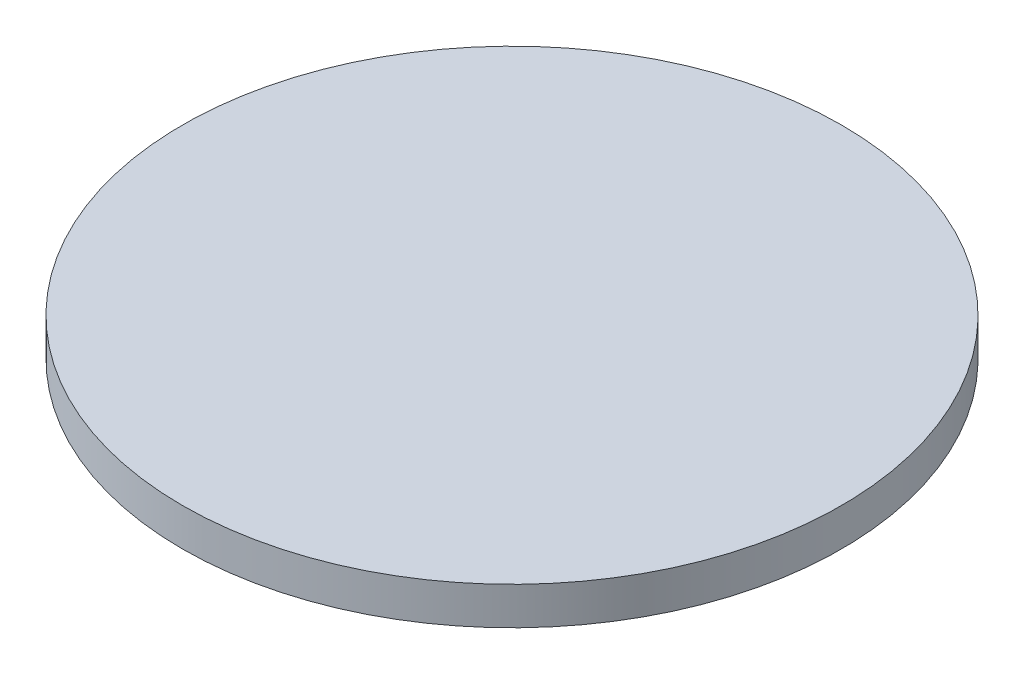
ISO-10303-21;
HEADER;
FILE_DESCRIPTION(('STEP AP214'),'2;1');
FILE_NAME('part.step','',(''),(''),'','','');
FILE_SCHEMA(('AUTOMOTIVE_DESIGN { 1 0 10303 214 1 1 1 1 }'));
ENDSEC;
DATA;
#1=APPLICATION_CONTEXT('core data for automotive mechanical design processes');
#2=APPLICATION_PROTOCOL_DEFINITION('international standard','automotive_design',2000,#1);
#3=PRODUCT_CONTEXT('',#1,'mechanical');
#4=PRODUCT('Part','Part','',(#3));
#5=PRODUCT_RELATED_PRODUCT_CATEGORY('part','',(#4));
#6=PRODUCT_DEFINITION_FORMATION('','',#4);
#7=PRODUCT_DEFINITION_CONTEXT('part definition',#1,'design');
#8=PRODUCT_DEFINITION('design','',#6,#7);
#9=PRODUCT_DEFINITION_SHAPE('','',#8);
#10=(LENGTH_UNIT() NAMED_UNIT(*) SI_UNIT(.MILLI.,.METRE.));
#11=(NAMED_UNIT(*) PLANE_ANGLE_UNIT() SI_UNIT($,.RADIAN.));
#12=(NAMED_UNIT(*) SI_UNIT($,.STERADIAN.) SOLID_ANGLE_UNIT());
#13=UNCERTAINTY_MEASURE_WITH_UNIT(LENGTH_MEASURE(1.E-05),#10,'distance_accuracy_value','');
#14=(GEOMETRIC_REPRESENTATION_CONTEXT(3) GLOBAL_UNCERTAINTY_ASSIGNED_CONTEXT((#13)) GLOBAL_UNIT_ASSIGNED_CONTEXT((#10,
#11,#12)) REPRESENTATION_CONTEXT('',''));
#15=CARTESIAN_POINT('',(0.,0.,0.));
#16=DIRECTION('',(0.,0.,1.));
#17=DIRECTION('',(1.,0.,0.));
#18=AXIS2_PLACEMENT_3D('',#15,#16,#17);
#19=CARTESIAN_POINT('',(0.,10.,0.));
#20=DIRECTION('',(0.,-1.,0.));
#21=DIRECTION('',(0.,0.,-1.));
#22=AXIS2_PLACEMENT_3D('',#19,#20,#21);
#23=CYLINDRICAL_SURFACE('',#22,87.5);
#24=CARTESIAN_POINT('',(0.,10.,0.));
#25=DIRECTION('',(0.,1.,0.));
#26=DIRECTION('',(0.,0.,1.));
#27=AXIS2_PLACEMENT_3D('',#24,#25,#26);
#28=CIRCLE('',#27,87.5);
#29=CARTESIAN_POINT('',(0.,10.,87.5));
#30=VERTEX_POINT('',#29);
#31=EDGE_CURVE('E10',#30,#30,#28,.T.);
#32=ORIENTED_EDGE('',*,*,#31,.F.);
#33=EDGE_LOOP('',(#32));
#34=FACE_BOUND('',#33,.T.);
#35=CARTESIAN_POINT('',(0.,0.,0.));
#36=DIRECTION('',(0.,1.,0.));
#37=DIRECTION('',(0.,0.,1.));
#38=AXIS2_PLACEMENT_3D('',#35,#36,#37);
#39=CIRCLE('',#38,87.5);
#40=CARTESIAN_POINT('',(0.,0.,87.5));
#41=VERTEX_POINT('',#40);
#42=EDGE_CURVE('E40',#41,#41,#39,.T.);
#43=ORIENTED_EDGE('',*,*,#42,.T.);
#44=EDGE_LOOP('',(#43));
#45=FACE_BOUND('',#44,.T.);
#46=ADVANCED_FACE('F37',(#34,#45),#23,.T.);
#47=CARTESIAN_POINT('',(0.,10.,0.));
#48=DIRECTION('',(0.,1.,0.));
#49=DIRECTION('',(0.,0.,1.));
#50=AXIS2_PLACEMENT_3D('',#47,#48,#49);
#51=PLANE('',#50);
#52=ORIENTED_EDGE('',*,*,#31,.T.);
#53=EDGE_LOOP('',(#52));
#54=FACE_BOUND('',#53,.T.);
#55=ADVANCED_FACE('F54',(#54),#51,.T.);
#56=CARTESIAN_POINT('',(0.,0.,0.));
#57=DIRECTION('',(0.,1.,0.));
#58=DIRECTION('',(0.,0.,1.));
#59=AXIS2_PLACEMENT_3D('',#56,#57,#58);
#60=PLANE('',#59);
#61=ORIENTED_EDGE('',*,*,#42,.F.);
#62=EDGE_LOOP('',(#61));
#63=FACE_BOUND('',#62,.T.);
#64=ADVANCED_FACE('F52',(#63),#60,.F.);
#65=CLOSED_SHELL('',(#46,#55,#64));
#66=MANIFOLD_SOLID_BREP('B2',#65);
#67=ADVANCED_BREP_SHAPE_REPRESENTATION('',(#18,#66),#14);
#68=SHAPE_DEFINITION_REPRESENTATION(#9,#67);
ENDSEC;
END-ISO-10303-21;
